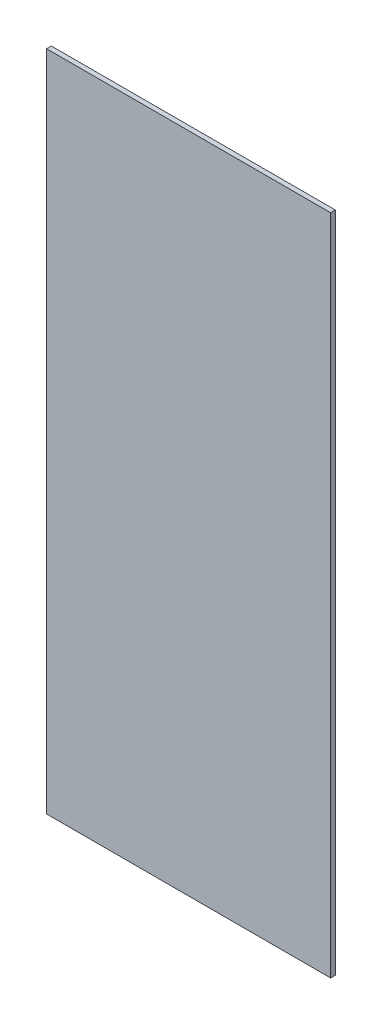
ISO-10303-21;
HEADER;
FILE_DESCRIPTION(('STEP AP214'),'2;1');
FILE_NAME('part.step','',(''),(''),'','','');
FILE_SCHEMA(('AUTOMOTIVE_DESIGN { 1 0 10303 214 1 1 1 1 }'));
ENDSEC;
DATA;
#1=APPLICATION_CONTEXT('core data for automotive mechanical design processes');
#2=APPLICATION_PROTOCOL_DEFINITION('international standard','automotive_design',2000,#1);
#3=PRODUCT_CONTEXT('',#1,'mechanical');
#4=PRODUCT('Part','Part','',(#3));
#5=PRODUCT_RELATED_PRODUCT_CATEGORY('part','',(#4));
#6=PRODUCT_DEFINITION_FORMATION('','',#4);
#7=PRODUCT_DEFINITION_CONTEXT('part definition',#1,'design');
#8=PRODUCT_DEFINITION('design','',#6,#7);
#9=PRODUCT_DEFINITION_SHAPE('','',#8);
#10=(LENGTH_UNIT() NAMED_UNIT(*) SI_UNIT(.MILLI.,.METRE.));
#11=(NAMED_UNIT(*) PLANE_ANGLE_UNIT() SI_UNIT($,.RADIAN.));
#12=(NAMED_UNIT(*) SI_UNIT($,.STERADIAN.) SOLID_ANGLE_UNIT());
#13=UNCERTAINTY_MEASURE_WITH_UNIT(LENGTH_MEASURE(1.E-05),#10,'distance_accuracy_value','');
#14=(GEOMETRIC_REPRESENTATION_CONTEXT(3) GLOBAL_UNCERTAINTY_ASSIGNED_CONTEXT((#13)) GLOBAL_UNIT_ASSIGNED_CONTEXT((#10,
#11,#12)) REPRESENTATION_CONTEXT('',''));
#15=CARTESIAN_POINT('',(0.,0.,0.));
#16=DIRECTION('',(0.,0.,1.));
#17=DIRECTION('',(1.,0.,0.));
#18=AXIS2_PLACEMENT_3D('',#15,#16,#17);
#19=CARTESIAN_POINT('',(0.,0.,5.));
#20=DIRECTION('',(1.,0.,0.));
#21=DIRECTION('',(0.,0.,-1.));
#22=AXIS2_PLACEMENT_3D('',#19,#20,#21);
#23=PLANE('',#22);
#24=DIRECTION('',(0.,-1.,0.));
#25=VECTOR('',#24,1.);
#26=CARTESIAN_POINT('',(0.,0.,0.));
#27=LINE('',#26,#25);
#28=CARTESIAN_POINT('',(0.,700.,0.));
#29=VERTEX_POINT('',#28);
#30=CARTESIAN_POINT('',(0.,0.,0.));
#31=VERTEX_POINT('',#30);
#32=EDGE_CURVE('E95',#29,#31,#27,.T.);
#33=ORIENTED_EDGE('',*,*,#32,.T.);
#34=DIRECTION('',(0.,0.,-1.));
#35=VECTOR('',#34,1.);
#36=CARTESIAN_POINT('',(0.,0.,5.));
#37=LINE('',#36,#35);
#38=CARTESIAN_POINT('',(0.,0.,5.));
#39=VERTEX_POINT('',#38);
#40=EDGE_CURVE('E11',#39,#31,#37,.T.);
#41=ORIENTED_EDGE('',*,*,#40,.F.);
#42=DIRECTION('',(0.,-1.,0.));
#43=VECTOR('',#42,1.);
#44=CARTESIAN_POINT('',(0.,0.,5.));
#45=LINE('',#44,#43);
#46=CARTESIAN_POINT('',(0.,700.,5.));
#47=VERTEX_POINT('',#46);
#48=EDGE_CURVE('E83',#47,#39,#45,.T.);
#49=ORIENTED_EDGE('',*,*,#48,.F.);
#50=DIRECTION('',(0.,0.,-1.));
#51=VECTOR('',#50,1.);
#52=CARTESIAN_POINT('',(0.,700.,5.));
#53=LINE('',#52,#51);
#54=EDGE_CURVE('E91',#47,#29,#53,.T.);
#55=ORIENTED_EDGE('',*,*,#54,.T.);
#56=EDGE_LOOP('',(#33,#41,#49,#55));
#57=FACE_BOUND('',#56,.T.);
#58=ADVANCED_FACE('F32',(#57),#23,.F.);
#59=CARTESIAN_POINT('',(0.,0.,5.));
#60=DIRECTION('',(0.,1.,0.));
#61=DIRECTION('',(0.,0.,1.));
#62=AXIS2_PLACEMENT_3D('',#59,#60,#61);
#63=PLANE('',#62);
#64=DIRECTION('',(1.,0.,0.));
#65=VECTOR('',#64,1.);
#66=CARTESIAN_POINT('',(0.,0.,0.));
#67=LINE('',#66,#65);
#68=CARTESIAN_POINT('',(300.,0.,0.));
#69=VERTEX_POINT('',#68);
#70=EDGE_CURVE('E87',#31,#69,#67,.T.);
#71=ORIENTED_EDGE('',*,*,#70,.T.);
#72=DIRECTION('',(0.,0.,-1.));
#73=VECTOR('',#72,1.);
#74=CARTESIAN_POINT('',(300.,0.,5.));
#75=LINE('',#74,#73);
#76=CARTESIAN_POINT('',(300.,0.,5.));
#77=VERTEX_POINT('',#76);
#78=EDGE_CURVE('E40',#77,#69,#75,.T.);
#79=ORIENTED_EDGE('',*,*,#78,.F.);
#80=DIRECTION('',(1.,0.,0.));
#81=VECTOR('',#80,1.);
#82=CARTESIAN_POINT('',(0.,0.,5.));
#83=LINE('',#82,#81);
#84=EDGE_CURVE('E78',#39,#77,#83,.T.);
#85=ORIENTED_EDGE('',*,*,#84,.F.);
#86=ORIENTED_EDGE('',*,*,#40,.T.);
#87=EDGE_LOOP('',(#71,#79,#85,#86));
#88=FACE_BOUND('',#87,.T.);
#89=ADVANCED_FACE('F86',(#88),#63,.F.);
#90=CARTESIAN_POINT('',(300.,0.,5.));
#91=DIRECTION('',(-1.,0.,0.));
#92=DIRECTION('',(0.,0.,1.));
#93=AXIS2_PLACEMENT_3D('',#90,#91,#92);
#94=PLANE('',#93);
#95=DIRECTION('',(0.,1.,0.));
#96=VECTOR('',#95,1.);
#97=CARTESIAN_POINT('',(300.,0.,0.));
#98=LINE('',#97,#96);
#99=CARTESIAN_POINT('',(300.,700.,0.));
#100=VERTEX_POINT('',#99);
#101=EDGE_CURVE('E65',#69,#100,#98,.T.);
#102=ORIENTED_EDGE('',*,*,#101,.T.);
#103=DIRECTION('',(0.,0.,-1.));
#104=VECTOR('',#103,1.);
#105=CARTESIAN_POINT('',(300.,700.,5.));
#106=LINE('',#105,#104);
#107=CARTESIAN_POINT('',(300.,700.,5.));
#108=VERTEX_POINT('',#107);
#109=EDGE_CURVE('E88',#108,#100,#106,.T.);
#110=ORIENTED_EDGE('',*,*,#109,.F.);
#111=DIRECTION('',(0.,1.,0.));
#112=VECTOR('',#111,1.);
#113=CARTESIAN_POINT('',(300.,0.,5.));
#114=LINE('',#113,#112);
#115=EDGE_CURVE('E81',#77,#108,#114,.T.);
#116=ORIENTED_EDGE('',*,*,#115,.F.);
#117=ORIENTED_EDGE('',*,*,#78,.T.);
#118=EDGE_LOOP('',(#102,#110,#116,#117));
#119=FACE_BOUND('',#118,.T.);
#120=ADVANCED_FACE('F89',(#119),#94,.F.);
#121=CARTESIAN_POINT('',(0.,700.,5.));
#122=DIRECTION('',(0.,-1.,0.));
#123=DIRECTION('',(0.,0.,-1.));
#124=AXIS2_PLACEMENT_3D('',#121,#122,#123);
#125=PLANE('',#124);
#126=DIRECTION('',(-1.,0.,0.));
#127=VECTOR('',#126,1.);
#128=CARTESIAN_POINT('',(0.,700.,0.));
#129=LINE('',#128,#127);
#130=EDGE_CURVE('E71',#100,#29,#129,.T.);
#131=ORIENTED_EDGE('',*,*,#130,.T.);
#132=ORIENTED_EDGE('',*,*,#54,.F.);
#133=DIRECTION('',(-1.,0.,0.));
#134=VECTOR('',#133,1.);
#135=CARTESIAN_POINT('',(0.,700.,5.));
#136=LINE('',#135,#134);
#137=EDGE_CURVE('E48',#108,#47,#136,.T.);
#138=ORIENTED_EDGE('',*,*,#137,.F.);
#139=ORIENTED_EDGE('',*,*,#109,.T.);
#140=EDGE_LOOP('',(#131,#132,#138,#139));
#141=FACE_BOUND('',#140,.T.);
#142=ADVANCED_FACE('F102',(#141),#125,.F.);
#143=CARTESIAN_POINT('',(0.,0.,5.));
#144=DIRECTION('',(0.,0.,-1.));
#145=DIRECTION('',(-1.,0.,0.));
#146=AXIS2_PLACEMENT_3D('',#143,#144,#145);
#147=PLANE('',#146);
#148=ORIENTED_EDGE('',*,*,#48,.T.);
#149=ORIENTED_EDGE('',*,*,#84,.T.);
#150=ORIENTED_EDGE('',*,*,#115,.T.);
#151=ORIENTED_EDGE('',*,*,#137,.T.);
#152=EDGE_LOOP('',(#148,#149,#150,#151));
#153=FACE_BOUND('',#152,.T.);
#154=ADVANCED_FACE('F79',(#153),#147,.F.);
#155=CARTESIAN_POINT('',(0.,0.,0.));
#156=DIRECTION('',(0.,0.,-1.));
#157=DIRECTION('',(-1.,0.,0.));
#158=AXIS2_PLACEMENT_3D('',#155,#156,#157);
#159=PLANE('',#158);
#160=ORIENTED_EDGE('',*,*,#32,.F.);
#161=ORIENTED_EDGE('',*,*,#130,.F.);
#162=ORIENTED_EDGE('',*,*,#101,.F.);
#163=ORIENTED_EDGE('',*,*,#70,.F.);
#164=EDGE_LOOP('',(#160,#161,#162,#163));
#165=FACE_BOUND('',#164,.T.);
#166=ADVANCED_FACE('F105',(#165),#159,.T.);
#167=CLOSED_SHELL('',(#58,#89,#120,#142,#154,#166));
#168=MANIFOLD_SOLID_BREP('B2',#167);
#169=ADVANCED_BREP_SHAPE_REPRESENTATION('',(#18,#168),#14);
#170=SHAPE_DEFINITION_REPRESENTATION(#9,#169);
ENDSEC;
END-ISO-10303-21;
